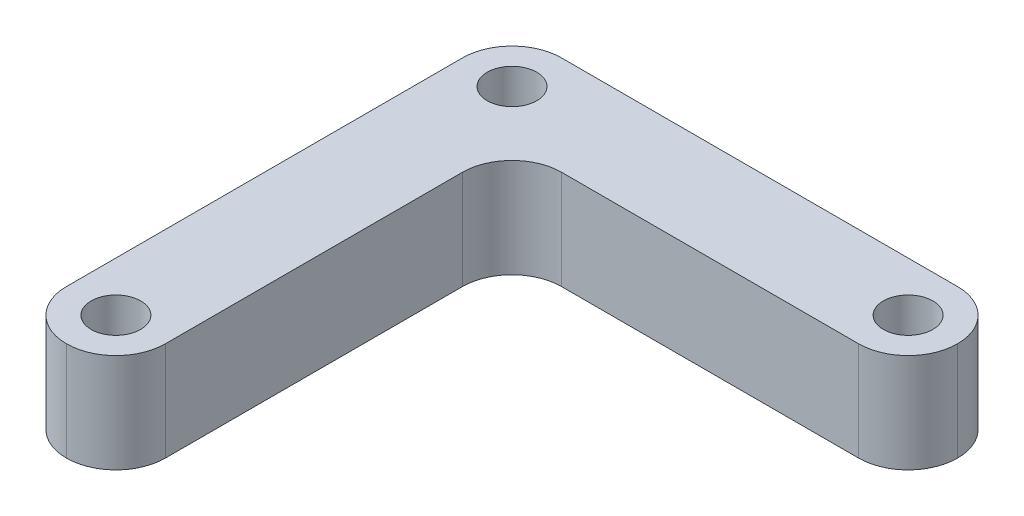
ISO-10303-21;
HEADER;
FILE_DESCRIPTION(('STEP AP214'),'2;1');
FILE_NAME('part.step','',(''),(''),'','','');
FILE_SCHEMA(('AUTOMOTIVE_DESIGN { 1 0 10303 214 1 1 1 1 }'));
ENDSEC;
DATA;
#1=APPLICATION_CONTEXT('core data for automotive mechanical design processes');
#2=APPLICATION_PROTOCOL_DEFINITION('international standard','automotive_design',2000,#1);
#3=PRODUCT_CONTEXT('',#1,'mechanical');
#4=PRODUCT('Part','Part','',(#3));
#5=PRODUCT_RELATED_PRODUCT_CATEGORY('part','',(#4));
#6=PRODUCT_DEFINITION_FORMATION('','',#4);
#7=PRODUCT_DEFINITION_CONTEXT('part definition',#1,'design');
#8=PRODUCT_DEFINITION('design','',#6,#7);
#9=PRODUCT_DEFINITION_SHAPE('','',#8);
#10=(LENGTH_UNIT() NAMED_UNIT(*) SI_UNIT(.MILLI.,.METRE.));
#11=(NAMED_UNIT(*) PLANE_ANGLE_UNIT() SI_UNIT($,.RADIAN.));
#12=(NAMED_UNIT(*) SI_UNIT($,.STERADIAN.) SOLID_ANGLE_UNIT());
#13=UNCERTAINTY_MEASURE_WITH_UNIT(LENGTH_MEASURE(1.E-05),#10,'distance_accuracy_value','');
#14=(GEOMETRIC_REPRESENTATION_CONTEXT(3) GLOBAL_UNCERTAINTY_ASSIGNED_CONTEXT((#13)) GLOBAL_UNIT_ASSIGNED_CONTEXT((#10,
#11,#12)) REPRESENTATION_CONTEXT('',''));
#15=CARTESIAN_POINT('',(0.,0.,0.));
#16=DIRECTION('',(0.,0.,1.));
#17=DIRECTION('',(1.,0.,0.));
#18=AXIS2_PLACEMENT_3D('',#15,#16,#17);
#19=CARTESIAN_POINT('',(-12.5,5.,-12.5));
#20=DIRECTION('',(0.,0.,1.));
#21=DIRECTION('',(1.,0.,0.));
#22=AXIS2_PLACEMENT_3D('',#19,#20,#21);
#23=PLANE('',#22);
#24=DIRECTION('',(-1.,0.,0.));
#25=VECTOR('',#24,1.);
#26=CARTESIAN_POINT('',(-12.5,5.,-12.5));
#27=LINE('',#26,#25);
#28=CARTESIAN_POINT('',(9.99999999999999,5.,-12.5));
#29=VERTEX_POINT('',#28);
#30=CARTESIAN_POINT('',(-10.,5.,-12.5));
#31=VERTEX_POINT('',#30);
#32=EDGE_CURVE('E165',#29,#31,#27,.T.);
#33=ORIENTED_EDGE('',*,*,#32,.F.);
#34=DIRECTION('',(0.,-1.,0.));
#35=VECTOR('',#34,1.);
#36=CARTESIAN_POINT('',(10.,5.,-12.5));
#37=LINE('',#36,#35);
#38=CARTESIAN_POINT('',(9.99999999999999,0.,-12.5));
#39=VERTEX_POINT('',#38);
#40=EDGE_CURVE('E120',#29,#39,#37,.T.);
#41=ORIENTED_EDGE('',*,*,#40,.T.);
#42=DIRECTION('',(-1.,0.,0.));
#43=VECTOR('',#42,1.);
#44=CARTESIAN_POINT('',(-12.5,0.,-12.5));
#45=LINE('',#44,#43);
#46=CARTESIAN_POINT('',(-10.,0.,-12.5));
#47=VERTEX_POINT('',#46);
#48=EDGE_CURVE('E162',#39,#47,#45,.T.);
#49=ORIENTED_EDGE('',*,*,#48,.T.);
#50=DIRECTION('',(0.,-1.,0.));
#51=VECTOR('',#50,1.);
#52=CARTESIAN_POINT('',(-10.,5.,-12.5));
#53=LINE('',#52,#51);
#54=EDGE_CURVE('E201',#47,#31,#53,.F.);
#55=ORIENTED_EDGE('',*,*,#54,.T.);
#56=EDGE_LOOP('',(#33,#41,#49,#55));
#57=FACE_BOUND('',#56,.T.);
#58=ADVANCED_FACE('F33',(#57),#23,.F.);
#59=CARTESIAN_POINT('',(-12.5,5.,12.5));
#60=DIRECTION('',(1.,0.,0.));
#61=DIRECTION('',(0.,0.,-1.));
#62=AXIS2_PLACEMENT_3D('',#59,#60,#61);
#63=PLANE('',#62);
#64=DIRECTION('',(0.,0.,1.));
#65=VECTOR('',#64,1.);
#66=CARTESIAN_POINT('',(-12.5,0.,12.5));
#67=LINE('',#66,#65);
#68=CARTESIAN_POINT('',(-12.5,0.,-9.99999999999999));
#69=VERTEX_POINT('',#68);
#70=CARTESIAN_POINT('',(-12.5,0.,10.));
#71=VERTEX_POINT('',#70);
#72=EDGE_CURVE('E169',#69,#71,#67,.T.);
#73=ORIENTED_EDGE('',*,*,#72,.T.);
#74=DIRECTION('',(0.,-1.,0.));
#75=VECTOR('',#74,1.);
#76=CARTESIAN_POINT('',(-12.5,5.,10.));
#77=LINE('',#76,#75);
#78=CARTESIAN_POINT('',(-12.5,5.,10.));
#79=VERTEX_POINT('',#78);
#80=EDGE_CURVE('E199',#71,#79,#77,.F.);
#81=ORIENTED_EDGE('',*,*,#80,.T.);
#82=DIRECTION('',(0.,0.,1.));
#83=VECTOR('',#82,1.);
#84=CARTESIAN_POINT('',(-12.5,5.,12.5));
#85=LINE('',#84,#83);
#86=CARTESIAN_POINT('',(-12.5,5.,-9.99999999999999));
#87=VERTEX_POINT('',#86);
#88=EDGE_CURVE('E168',#87,#79,#85,.T.);
#89=ORIENTED_EDGE('',*,*,#88,.F.);
#90=DIRECTION('',(0.,-1.,0.));
#91=VECTOR('',#90,1.);
#92=CARTESIAN_POINT('',(-12.5,5.,-10.));
#93=LINE('',#92,#91);
#94=EDGE_CURVE('E196',#87,#69,#93,.T.);
#95=ORIENTED_EDGE('',*,*,#94,.T.);
#96=EDGE_LOOP('',(#73,#81,#89,#95));
#97=FACE_BOUND('',#96,.T.);
#98=ADVANCED_FACE('F218',(#97),#63,.F.);
#99=CARTESIAN_POINT('',(0.,5.,0.));
#100=DIRECTION('',(0.,-1.,0.));
#101=DIRECTION('',(0.,0.,-1.));
#102=AXIS2_PLACEMENT_3D('',#99,#100,#101);
#103=PLANE('',#102);
#104=CARTESIAN_POINT('',(-10.,5.,10.));
#105=DIRECTION('',(0.,1.,0.));
#106=DIRECTION('',(0.,0.,1.));
#107=AXIS2_PLACEMENT_3D('',#104,#105,#106);
#108=CIRCLE('',#107,1.25);
#109=CARTESIAN_POINT('',(-10.,5.,11.25));
#110=VERTEX_POINT('',#109);
#111=EDGE_CURVE('E156',#110,#110,#108,.T.);
#112=ORIENTED_EDGE('',*,*,#111,.F.);
#113=EDGE_LOOP('',(#112));
#114=FACE_BOUND('',#113,.T.);
#115=CARTESIAN_POINT('',(10.,5.,-10.));
#116=DIRECTION('',(0.,1.,0.));
#117=DIRECTION('',(0.,0.,1.));
#118=AXIS2_PLACEMENT_3D('',#115,#116,#117);
#119=CIRCLE('',#118,1.25);
#120=CARTESIAN_POINT('',(10.,5.,-8.75));
#121=VERTEX_POINT('',#120);
#122=EDGE_CURVE('E150',#121,#121,#119,.T.);
#123=ORIENTED_EDGE('',*,*,#122,.F.);
#124=EDGE_LOOP('',(#123));
#125=FACE_BOUND('',#124,.T.);
#126=CARTESIAN_POINT('',(-10.,5.,-10.));
#127=DIRECTION('',(0.,1.,0.));
#128=DIRECTION('',(0.,0.,1.));
#129=AXIS2_PLACEMENT_3D('',#126,#127,#128);
#130=CIRCLE('',#129,1.25);
#131=CARTESIAN_POINT('',(-10.,5.,-8.75));
#132=VERTEX_POINT('',#131);
#133=EDGE_CURVE('E149',#132,#132,#130,.T.);
#134=ORIENTED_EDGE('',*,*,#133,.F.);
#135=EDGE_LOOP('',(#134));
#136=FACE_BOUND('',#135,.T.);
#137=CARTESIAN_POINT('',(-10.,5.,10.));
#138=DIRECTION('',(0.,-1.,0.));
#139=DIRECTION('',(0.,0.,-1.));
#140=AXIS2_PLACEMENT_3D('',#137,#138,#139);
#141=CIRCLE('',#140,2.5);
#142=CARTESIAN_POINT('',(-10.,5.,12.5));
#143=VERTEX_POINT('',#142);
#144=EDGE_CURVE('E185',#79,#143,#141,.F.);
#145=ORIENTED_EDGE('',*,*,#144,.T.);
#146=CARTESIAN_POINT('',(-10.,5.,10.));
#147=DIRECTION('',(0.,-1.,0.));
#148=DIRECTION('',(0.,0.,-1.));
#149=AXIS2_PLACEMENT_3D('',#146,#147,#148);
#150=CIRCLE('',#149,2.5);
#151=CARTESIAN_POINT('',(-7.5,5.,10.));
#152=VERTEX_POINT('',#151);
#153=EDGE_CURVE('E136',#143,#152,#150,.F.);
#154=ORIENTED_EDGE('',*,*,#153,.T.);
#155=DIRECTION('',(0.,0.,1.));
#156=VECTOR('',#155,1.);
#157=CARTESIAN_POINT('',(-7.5,5.,12.5));
#158=LINE('',#157,#156);
#159=CARTESIAN_POINT('',(-7.5,5.,-5.));
#160=VERTEX_POINT('',#159);
#161=EDGE_CURVE('E127',#160,#152,#158,.T.);
#162=ORIENTED_EDGE('',*,*,#161,.F.);
#163=CARTESIAN_POINT('',(-5.,5.,-5.));
#164=DIRECTION('',(0.,-1.,0.));
#165=DIRECTION('',(0.,0.,-1.));
#166=AXIS2_PLACEMENT_3D('',#163,#164,#165);
#167=CIRCLE('',#166,2.5);
#168=CARTESIAN_POINT('',(-5.,5.,-7.5));
#169=VERTEX_POINT('',#168);
#170=EDGE_CURVE('E42',#160,#169,#167,.T.);
#171=ORIENTED_EDGE('',*,*,#170,.T.);
#172=DIRECTION('',(-1.,0.,0.));
#173=VECTOR('',#172,1.);
#174=CARTESIAN_POINT('',(12.5,5.,-7.5));
#175=LINE('',#174,#173);
#176=CARTESIAN_POINT('',(10.,5.,-7.5));
#177=VERTEX_POINT('',#176);
#178=EDGE_CURVE('E138',#177,#169,#175,.T.);
#179=ORIENTED_EDGE('',*,*,#178,.F.);
#180=CARTESIAN_POINT('',(10.,5.,-10.));
#181=DIRECTION('',(0.,-1.,0.));
#182=DIRECTION('',(0.,0.,-1.));
#183=AXIS2_PLACEMENT_3D('',#180,#181,#182);
#184=CIRCLE('',#183,2.5);
#185=CARTESIAN_POINT('',(12.5,5.,-9.99999999999999));
#186=VERTEX_POINT('',#185);
#187=EDGE_CURVE('E183',#177,#186,#184,.F.);
#188=ORIENTED_EDGE('',*,*,#187,.T.);
#189=CARTESIAN_POINT('',(10.,5.,-10.));
#190=DIRECTION('',(0.,-1.,0.));
#191=DIRECTION('',(0.,0.,-1.));
#192=AXIS2_PLACEMENT_3D('',#189,#190,#191);
#193=CIRCLE('',#192,2.5);
#194=EDGE_CURVE('E181',#186,#29,#193,.F.);
#195=ORIENTED_EDGE('',*,*,#194,.T.);
#196=ORIENTED_EDGE('',*,*,#32,.T.);
#197=CARTESIAN_POINT('',(-10.,5.,-10.));
#198=DIRECTION('',(0.,-1.,0.));
#199=DIRECTION('',(0.,0.,-1.));
#200=AXIS2_PLACEMENT_3D('',#197,#198,#199);
#201=CIRCLE('',#200,2.5);
#202=EDGE_CURVE('E179',#31,#87,#201,.F.);
#203=ORIENTED_EDGE('',*,*,#202,.T.);
#204=ORIENTED_EDGE('',*,*,#88,.T.);
#205=EDGE_LOOP('',(#145,#154,#162,#171,#179,#188,#195,#196,#203,#204));
#206=FACE_BOUND('',#205,.T.);
#207=ADVANCED_FACE('F134',(#114,#125,#136,#206),#103,.F.);
#208=CARTESIAN_POINT('',(0.,0.,0.));
#209=DIRECTION('',(0.,-1.,0.));
#210=DIRECTION('',(0.,0.,-1.));
#211=AXIS2_PLACEMENT_3D('',#208,#209,#210);
#212=PLANE('',#211);
#213=DIRECTION('',(0.,0.,1.));
#214=VECTOR('',#213,1.);
#215=CARTESIAN_POINT('',(-7.5,0.,12.5));
#216=LINE('',#215,#214);
#217=CARTESIAN_POINT('',(-7.5,0.,-5.));
#218=VERTEX_POINT('',#217);
#219=CARTESIAN_POINT('',(-7.5,0.,10.));
#220=VERTEX_POINT('',#219);
#221=EDGE_CURVE('E130',#218,#220,#216,.T.);
#222=ORIENTED_EDGE('',*,*,#221,.T.);
#223=CARTESIAN_POINT('',(-10.,0.,10.));
#224=DIRECTION('',(0.,-1.,0.));
#225=DIRECTION('',(0.,0.,-1.));
#226=AXIS2_PLACEMENT_3D('',#223,#224,#225);
#227=CIRCLE('',#226,2.5);
#228=CARTESIAN_POINT('',(-10.,0.,12.5));
#229=VERTEX_POINT('',#228);
#230=EDGE_CURVE('E194',#220,#229,#227,.T.);
#231=ORIENTED_EDGE('',*,*,#230,.T.);
#232=CARTESIAN_POINT('',(-10.,0.,10.));
#233=DIRECTION('',(0.,-1.,0.));
#234=DIRECTION('',(0.,0.,-1.));
#235=AXIS2_PLACEMENT_3D('',#232,#233,#234);
#236=CIRCLE('',#235,2.5);
#237=EDGE_CURVE('E192',#229,#71,#236,.T.);
#238=ORIENTED_EDGE('',*,*,#237,.T.);
#239=ORIENTED_EDGE('',*,*,#72,.F.);
#240=CARTESIAN_POINT('',(-10.,0.,-10.));
#241=DIRECTION('',(0.,-1.,0.));
#242=DIRECTION('',(0.,0.,-1.));
#243=AXIS2_PLACEMENT_3D('',#240,#241,#242);
#244=CIRCLE('',#243,2.5);
#245=EDGE_CURVE('E56',#69,#47,#244,.T.);
#246=ORIENTED_EDGE('',*,*,#245,.T.);
#247=ORIENTED_EDGE('',*,*,#48,.F.);
#248=CARTESIAN_POINT('',(10.,0.,-10.));
#249=DIRECTION('',(0.,-1.,0.));
#250=DIRECTION('',(0.,0.,-1.));
#251=AXIS2_PLACEMENT_3D('',#248,#249,#250);
#252=CIRCLE('',#251,2.5);
#253=CARTESIAN_POINT('',(12.5,0.,-9.99999999999999));
#254=VERTEX_POINT('',#253);
#255=EDGE_CURVE('E50',#39,#254,#252,.T.);
#256=ORIENTED_EDGE('',*,*,#255,.T.);
#257=CARTESIAN_POINT('',(10.,0.,-10.));
#258=DIRECTION('',(0.,-1.,0.));
#259=DIRECTION('',(0.,0.,-1.));
#260=AXIS2_PLACEMENT_3D('',#257,#258,#259);
#261=CIRCLE('',#260,2.5);
#262=CARTESIAN_POINT('',(10.,0.,-7.5));
#263=VERTEX_POINT('',#262);
#264=EDGE_CURVE('E190',#254,#263,#261,.T.);
#265=ORIENTED_EDGE('',*,*,#264,.T.);
#266=DIRECTION('',(-1.,0.,0.));
#267=VECTOR('',#266,1.);
#268=CARTESIAN_POINT('',(12.5,0.,-7.5));
#269=LINE('',#268,#267);
#270=CARTESIAN_POINT('',(-5.,0.,-7.5));
#271=VERTEX_POINT('',#270);
#272=EDGE_CURVE('E137',#263,#271,#269,.T.);
#273=ORIENTED_EDGE('',*,*,#272,.T.);
#274=CARTESIAN_POINT('',(-5.,0.,-5.));
#275=DIRECTION('',(0.,-1.,0.));
#276=DIRECTION('',(0.,0.,-1.));
#277=AXIS2_PLACEMENT_3D('',#274,#275,#276);
#278=CIRCLE('',#277,2.5);
#279=EDGE_CURVE('E11',#271,#218,#278,.F.);
#280=ORIENTED_EDGE('',*,*,#279,.T.);
#281=EDGE_LOOP('',(#222,#231,#238,#239,#246,#247,#256,#265,#273,#280));
#282=FACE_BOUND('',#281,.T.);
#283=CARTESIAN_POINT('',(-10.,0.,10.));
#284=DIRECTION('',(0.,1.,0.));
#285=DIRECTION('',(0.,0.,1.));
#286=AXIS2_PLACEMENT_3D('',#283,#284,#285);
#287=CIRCLE('',#286,1.25);
#288=CARTESIAN_POINT('',(-10.,0.,11.25));
#289=VERTEX_POINT('',#288);
#290=EDGE_CURVE('E153',#289,#289,#287,.T.);
#291=ORIENTED_EDGE('',*,*,#290,.T.);
#292=EDGE_LOOP('',(#291));
#293=FACE_BOUND('',#292,.T.);
#294=CARTESIAN_POINT('',(10.,0.,-10.));
#295=DIRECTION('',(0.,1.,0.));
#296=DIRECTION('',(0.,0.,1.));
#297=AXIS2_PLACEMENT_3D('',#294,#295,#296);
#298=CIRCLE('',#297,1.25);
#299=CARTESIAN_POINT('',(10.,0.,-8.75));
#300=VERTEX_POINT('',#299);
#301=EDGE_CURVE('E146',#300,#300,#298,.T.);
#302=ORIENTED_EDGE('',*,*,#301,.T.);
#303=EDGE_LOOP('',(#302));
#304=FACE_BOUND('',#303,.T.);
#305=CARTESIAN_POINT('',(-10.,0.,-10.));
#306=DIRECTION('',(0.,1.,0.));
#307=DIRECTION('',(0.,0.,1.));
#308=AXIS2_PLACEMENT_3D('',#305,#306,#307);
#309=CIRCLE('',#308,1.25);
#310=CARTESIAN_POINT('',(-10.,0.,-8.75));
#311=VERTEX_POINT('',#310);
#312=EDGE_CURVE('E159',#311,#311,#309,.T.);
#313=ORIENTED_EDGE('',*,*,#312,.T.);
#314=EDGE_LOOP('',(#313));
#315=FACE_BOUND('',#314,.T.);
#316=ADVANCED_FACE('F215',(#282,#293,#304,#315),#212,.T.);
#317=CARTESIAN_POINT('',(-10.,0.,-10.));
#318=DIRECTION('',(0.,1.,0.));
#319=DIRECTION('',(0.,0.,1.));
#320=AXIS2_PLACEMENT_3D('',#317,#318,#319);
#321=CYLINDRICAL_SURFACE('',#320,1.25);
#322=ORIENTED_EDGE('',*,*,#312,.F.);
#323=EDGE_LOOP('',(#322));
#324=FACE_BOUND('',#323,.T.);
#325=ORIENTED_EDGE('',*,*,#133,.T.);
#326=EDGE_LOOP('',(#325));
#327=FACE_BOUND('',#326,.T.);
#328=ADVANCED_FACE('F319',(#324,#327),#321,.F.);
#329=CARTESIAN_POINT('',(10.,0.,-10.));
#330=DIRECTION('',(0.,1.,0.));
#331=DIRECTION('',(0.,0.,1.));
#332=AXIS2_PLACEMENT_3D('',#329,#330,#331);
#333=CYLINDRICAL_SURFACE('',#332,1.25);
#334=ORIENTED_EDGE('',*,*,#301,.F.);
#335=EDGE_LOOP('',(#334));
#336=FACE_BOUND('',#335,.T.);
#337=ORIENTED_EDGE('',*,*,#122,.T.);
#338=EDGE_LOOP('',(#337));
#339=FACE_BOUND('',#338,.T.);
#340=ADVANCED_FACE('F310',(#336,#339),#333,.F.);
#341=CARTESIAN_POINT('',(-10.,0.,10.));
#342=DIRECTION('',(0.,1.,0.));
#343=DIRECTION('',(0.,0.,1.));
#344=AXIS2_PLACEMENT_3D('',#341,#342,#343);
#345=CYLINDRICAL_SURFACE('',#344,1.25);
#346=ORIENTED_EDGE('',*,*,#290,.F.);
#347=EDGE_LOOP('',(#346));
#348=FACE_BOUND('',#347,.T.);
#349=ORIENTED_EDGE('',*,*,#111,.T.);
#350=EDGE_LOOP('',(#349));
#351=FACE_BOUND('',#350,.T.);
#352=ADVANCED_FACE('F242',(#348,#351),#345,.F.);
#353=CARTESIAN_POINT('',(-7.5,0.,12.5));
#354=DIRECTION('',(-1.,0.,0.));
#355=DIRECTION('',(0.,0.,1.));
#356=AXIS2_PLACEMENT_3D('',#353,#354,#355);
#357=PLANE('',#356);
#358=ORIENTED_EDGE('',*,*,#221,.F.);
#359=DIRECTION('',(0.,1.,0.));
#360=VECTOR('',#359,1.);
#361=CARTESIAN_POINT('',(-7.5,5.,-5.));
#362=LINE('',#361,#360);
#363=EDGE_CURVE('E114',#218,#160,#362,.T.);
#364=ORIENTED_EDGE('',*,*,#363,.T.);
#365=ORIENTED_EDGE('',*,*,#161,.T.);
#366=DIRECTION('',(0.,1.,0.));
#367=VECTOR('',#366,1.);
#368=CARTESIAN_POINT('',(-7.5,0.,10.));
#369=LINE('',#368,#367);
#370=EDGE_CURVE('E132',#152,#220,#369,.F.);
#371=ORIENTED_EDGE('',*,*,#370,.T.);
#372=EDGE_LOOP('',(#358,#364,#365,#371));
#373=FACE_BOUND('',#372,.T.);
#374=ADVANCED_FACE('F125',(#373),#357,.F.);
#375=CARTESIAN_POINT('',(12.5,0.,-7.5));
#376=DIRECTION('',(0.,0.,-1.));
#377=DIRECTION('',(-1.,0.,0.));
#378=AXIS2_PLACEMENT_3D('',#375,#376,#377);
#379=PLANE('',#378);
#380=ORIENTED_EDGE('',*,*,#178,.T.);
#381=DIRECTION('',(0.,1.,0.));
#382=VECTOR('',#381,1.);
#383=CARTESIAN_POINT('',(-5.,0.,-7.5));
#384=LINE('',#383,#382);
#385=EDGE_CURVE('E115',#169,#271,#384,.F.);
#386=ORIENTED_EDGE('',*,*,#385,.T.);
#387=ORIENTED_EDGE('',*,*,#272,.F.);
#388=DIRECTION('',(0.,1.,0.));
#389=VECTOR('',#388,1.);
#390=CARTESIAN_POINT('',(10.,0.,-7.5));
#391=LINE('',#390,#389);
#392=EDGE_CURVE('E131',#263,#177,#391,.T.);
#393=ORIENTED_EDGE('',*,*,#392,.T.);
#394=EDGE_LOOP('',(#380,#386,#387,#393));
#395=FACE_BOUND('',#394,.T.);
#396=ADVANCED_FACE('F234',(#395),#379,.F.);
#397=CARTESIAN_POINT('',(-5.,0.,-5.));
#398=DIRECTION('',(0.,-1.,0.));
#399=DIRECTION('',(0.,0.,-1.));
#400=AXIS2_PLACEMENT_3D('',#397,#398,#399);
#401=CYLINDRICAL_SURFACE('',#400,2.5);
#402=ORIENTED_EDGE('',*,*,#279,.F.);
#403=ORIENTED_EDGE('',*,*,#385,.F.);
#404=ORIENTED_EDGE('',*,*,#170,.F.);
#405=ORIENTED_EDGE('',*,*,#363,.F.);
#406=EDGE_LOOP('',(#402,#403,#404,#405));
#407=FACE_BOUND('',#406,.T.);
#408=ADVANCED_FACE('F113',(#407),#401,.F.);
#409=CARTESIAN_POINT('',(10.,5.,-10.));
#410=DIRECTION('',(0.,-1.,0.));
#411=DIRECTION('',(0.,0.,-1.));
#412=AXIS2_PLACEMENT_3D('',#409,#410,#411);
#413=CYLINDRICAL_SURFACE('',#412,2.5);
#414=DIRECTION('',(0.,-1.,0.));
#415=VECTOR('',#414,1.);
#416=CARTESIAN_POINT('',(12.5,5.,-10.));
#417=LINE('',#416,#415);
#418=EDGE_CURVE('E142',#254,#186,#417,.F.);
#419=ORIENTED_EDGE('',*,*,#418,.F.);
#420=ORIENTED_EDGE('',*,*,#255,.F.);
#421=ORIENTED_EDGE('',*,*,#40,.F.);
#422=ORIENTED_EDGE('',*,*,#194,.F.);
#423=EDGE_LOOP('',(#419,#420,#421,#422));
#424=FACE_BOUND('',#423,.T.);
#425=ADVANCED_FACE('F229',(#424),#413,.T.);
#426=CARTESIAN_POINT('',(10.,0.,-10.));
#427=DIRECTION('',(0.,1.,0.));
#428=DIRECTION('',(0.,0.,1.));
#429=AXIS2_PLACEMENT_3D('',#426,#427,#428);
#430=CYLINDRICAL_SURFACE('',#429,2.5);
#431=ORIENTED_EDGE('',*,*,#264,.F.);
#432=ORIENTED_EDGE('',*,*,#418,.T.);
#433=ORIENTED_EDGE('',*,*,#187,.F.);
#434=ORIENTED_EDGE('',*,*,#392,.F.);
#435=EDGE_LOOP('',(#431,#432,#433,#434));
#436=FACE_BOUND('',#435,.T.);
#437=ADVANCED_FACE('F231',(#436),#430,.T.);
#438=CARTESIAN_POINT('',(-10.,5.,10.));
#439=DIRECTION('',(0.,-1.,0.));
#440=DIRECTION('',(0.,0.,-1.));
#441=AXIS2_PLACEMENT_3D('',#438,#439,#440);
#442=CYLINDRICAL_SURFACE('',#441,2.5);
#443=ORIENTED_EDGE('',*,*,#80,.F.);
#444=ORIENTED_EDGE('',*,*,#237,.F.);
#445=DIRECTION('',(0.,-1.,0.));
#446=VECTOR('',#445,1.);
#447=CARTESIAN_POINT('',(-10.,5.,12.5));
#448=LINE('',#447,#446);
#449=EDGE_CURVE('E37',#143,#229,#448,.T.);
#450=ORIENTED_EDGE('',*,*,#449,.F.);
#451=ORIENTED_EDGE('',*,*,#144,.F.);
#452=EDGE_LOOP('',(#443,#444,#450,#451));
#453=FACE_BOUND('',#452,.T.);
#454=ADVANCED_FACE('F214',(#453),#442,.T.);
#455=CARTESIAN_POINT('',(-10.,5.,10.));
#456=DIRECTION('',(0.,1.,0.));
#457=DIRECTION('',(0.,0.,1.));
#458=AXIS2_PLACEMENT_3D('',#455,#456,#457);
#459=CYLINDRICAL_SURFACE('',#458,2.5);
#460=ORIENTED_EDGE('',*,*,#230,.F.);
#461=ORIENTED_EDGE('',*,*,#370,.F.);
#462=ORIENTED_EDGE('',*,*,#153,.F.);
#463=ORIENTED_EDGE('',*,*,#449,.T.);
#464=EDGE_LOOP('',(#460,#461,#462,#463));
#465=FACE_BOUND('',#464,.T.);
#466=ADVANCED_FACE('F209',(#465),#459,.T.);
#467=CARTESIAN_POINT('',(-10.,5.,-10.));
#468=DIRECTION('',(0.,-1.,0.));
#469=DIRECTION('',(0.,0.,-1.));
#470=AXIS2_PLACEMENT_3D('',#467,#468,#469);
#471=CYLINDRICAL_SURFACE('',#470,2.5);
#472=ORIENTED_EDGE('',*,*,#202,.F.);
#473=ORIENTED_EDGE('',*,*,#54,.F.);
#474=ORIENTED_EDGE('',*,*,#245,.F.);
#475=ORIENTED_EDGE('',*,*,#94,.F.);
#476=EDGE_LOOP('',(#472,#473,#474,#475));
#477=FACE_BOUND('',#476,.T.);
#478=ADVANCED_FACE('F35',(#477),#471,.T.);
#479=CLOSED_SHELL('',(#58,#98,#207,#316,#328,#340,#352,#374,#396,#408,#425,#437,#454,#466,#478));
#480=MANIFOLD_SOLID_BREP('B2',#479);
#481=ADVANCED_BREP_SHAPE_REPRESENTATION('',(#18,#480),#14);
#482=SHAPE_DEFINITION_REPRESENTATION(#9,#481);
ENDSEC;
END-ISO-10303-21;
